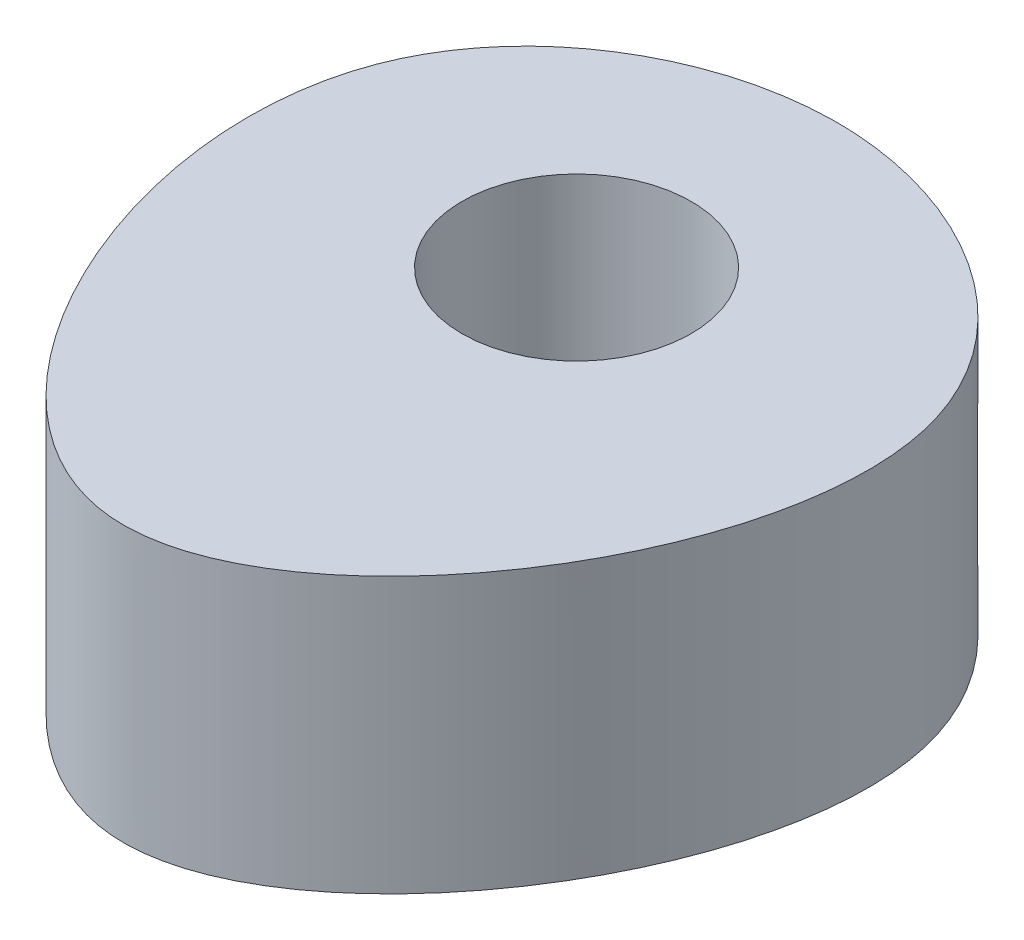
ISO-10303-21;
HEADER;
FILE_DESCRIPTION(('STEP AP214'),'2;1');
FILE_NAME('part.step','',(''),(''),'','','');
FILE_SCHEMA(('AUTOMOTIVE_DESIGN { 1 0 10303 214 1 1 1 1 }'));
ENDSEC;
DATA;
#1=APPLICATION_CONTEXT('core data for automotive mechanical design processes');
#2=APPLICATION_PROTOCOL_DEFINITION('international standard','automotive_design',2000,#1);
#3=PRODUCT_CONTEXT('',#1,'mechanical');
#4=PRODUCT('Part','Part','',(#3));
#5=PRODUCT_RELATED_PRODUCT_CATEGORY('part','',(#4));
#6=PRODUCT_DEFINITION_FORMATION('','',#4);
#7=PRODUCT_DEFINITION_CONTEXT('part definition',#1,'design');
#8=PRODUCT_DEFINITION('design','',#6,#7);
#9=PRODUCT_DEFINITION_SHAPE('','',#8);
#10=(LENGTH_UNIT() NAMED_UNIT(*) SI_UNIT(.MILLI.,.METRE.));
#11=(NAMED_UNIT(*) PLANE_ANGLE_UNIT() SI_UNIT($,.RADIAN.));
#12=(NAMED_UNIT(*) SI_UNIT($,.STERADIAN.) SOLID_ANGLE_UNIT());
#13=UNCERTAINTY_MEASURE_WITH_UNIT(LENGTH_MEASURE(1.E-05),#10,'distance_accuracy_value','');
#14=(GEOMETRIC_REPRESENTATION_CONTEXT(3) GLOBAL_UNCERTAINTY_ASSIGNED_CONTEXT((#13)) GLOBAL_UNIT_ASSIGNED_CONTEXT((#10,
#11,#12)) REPRESENTATION_CONTEXT('',''));
#15=CARTESIAN_POINT('',(0.,0.,0.));
#16=DIRECTION('',(0.,0.,1.));
#17=DIRECTION('',(1.,0.,0.));
#18=AXIS2_PLACEMENT_3D('',#15,#16,#17);
#19=CARTESIAN_POINT('',(1.15195998475415,30.,48.9622364822149));
#20=DIRECTION('',(0.,-1.,0.));
#21=DIRECTION('',(0.,0.,-1.));
#22=AXIS2_PLACEMENT_3D('',#19,#20,#21);
#23=PLANE('',#22);
#24=CARTESIAN_POINT('',(0.,30.,-27.9028182668132));
#25=CARTESIAN_POINT('',(-12.8653560561896,30.,-27.7229644163359));
#26=CARTESIAN_POINT('',(-47.9510198881678,30.,-7.00606831597385));
#27=CARTESIAN_POINT('',(-3.58547018882932,30.,83.1883366938912));
#28=CARTESIAN_POINT('',(54.0443844706418,30.,-4.07073540328584));
#29=CARTESIAN_POINT('',(14.8248103614878,30.,-28.1100647055797));
#30=CARTESIAN_POINT('',(0.,30.,-27.9028182668132));
#31=B_SPLINE_CURVE_WITH_KNOTS('',3,(#24,#25,#26,#27,#28,#29,#30),.UNSPECIFIED.,.T.,.F.,(4,1,1,1,
4),(0.,0.173631519767977,0.486630839659151,0.799923582208299,1.),.UNSPECIFIED.);
#32=CARTESIAN_POINT('',(0.,30.,-27.9028182668132));
#33=VERTEX_POINT('',#32);
#34=EDGE_CURVE('E10',#33,#33,#31,.T.);
#35=ORIENTED_EDGE('',*,*,#34,.T.);
#36=EDGE_LOOP('',(#35));
#37=FACE_BOUND('',#36,.T.);
#38=CARTESIAN_POINT('',(0.,30.,0.));
#39=DIRECTION('',(0.,1.,0.));
#40=DIRECTION('',(0.,0.,1.));
#41=AXIS2_PLACEMENT_3D('',#38,#39,#40);
#42=CIRCLE('',#41,12.5);
#43=CARTESIAN_POINT('',(0.,30.,12.5));
#44=VERTEX_POINT('',#43);
#45=EDGE_CURVE('E47',#44,#44,#42,.T.);
#46=ORIENTED_EDGE('',*,*,#45,.F.);
#47=EDGE_LOOP('',(#46));
#48=FACE_BOUND('',#47,.T.);
#49=ADVANCED_FACE('F34',(#37,#48),#23,.F.);
#50=CARTESIAN_POINT('',(1.15195998475415,0.,48.9622364822149));
#51=DIRECTION('',(0.,-1.,0.));
#52=DIRECTION('',(0.,0.,-1.));
#53=AXIS2_PLACEMENT_3D('',#50,#51,#52);
#54=PLANE('',#53);
#55=CARTESIAN_POINT('',(0.,0.,-27.9028182668132));
#56=CARTESIAN_POINT('',(-12.8653560561896,0.,-27.7229644163359));
#57=CARTESIAN_POINT('',(-47.9510198881678,0.,-7.00606831597385));
#58=CARTESIAN_POINT('',(-3.58547018882932,0.,83.1883366938912));
#59=CARTESIAN_POINT('',(54.0443844706418,0.,-4.07073540328584));
#60=CARTESIAN_POINT('',(14.8248103614878,0.,-28.1100647055797));
#61=CARTESIAN_POINT('',(0.,0.,-27.9028182668132));
#62=B_SPLINE_CURVE_WITH_KNOTS('',3,(#55,#56,#57,#58,#59,#60,#61),.UNSPECIFIED.,.T.,.F.,(4,1,1,1,
4),(0.,0.173631519767977,0.486630839659151,0.799923582208299,1.),.UNSPECIFIED.);
#63=CARTESIAN_POINT('',(0.,0.,-27.9028182668132));
#64=VERTEX_POINT('',#63);
#65=EDGE_CURVE('E39',#64,#64,#62,.T.);
#66=ORIENTED_EDGE('',*,*,#65,.F.);
#67=EDGE_LOOP('',(#66));
#68=FACE_BOUND('',#67,.T.);
#69=CARTESIAN_POINT('',(0.,0.,0.));
#70=DIRECTION('',(0.,1.,0.));
#71=DIRECTION('',(0.,0.,1.));
#72=AXIS2_PLACEMENT_3D('',#69,#70,#71);
#73=CIRCLE('',#72,12.5);
#74=CARTESIAN_POINT('',(0.,0.,12.5));
#75=VERTEX_POINT('',#74);
#76=EDGE_CURVE('E52',#75,#75,#73,.T.);
#77=ORIENTED_EDGE('',*,*,#76,.T.);
#78=EDGE_LOOP('',(#77));
#79=FACE_BOUND('',#78,.T.);
#80=ADVANCED_FACE('F65',(#68,#79),#54,.T.);
#81=DIRECTION('',(0.,-1.,0.));
#82=VECTOR('',#81,1.);
#83=SURFACE_OF_LINEAR_EXTRUSION('',#31,#82);
#84=ORIENTED_EDGE('',*,*,#34,.F.);
#85=EDGE_LOOP('',(#84));
#86=FACE_BOUND('',#85,.T.);
#87=ORIENTED_EDGE('',*,*,#65,.T.);
#88=EDGE_LOOP('',(#87));
#89=FACE_BOUND('',#88,.T.);
#90=ADVANCED_FACE('F36',(#86,#89),#83,.F.);
#91=CARTESIAN_POINT('',(0.,30.,0.));
#92=DIRECTION('',(0.,-1.,0.));
#93=DIRECTION('',(0.,0.,-1.));
#94=AXIS2_PLACEMENT_3D('',#91,#92,#93);
#95=CYLINDRICAL_SURFACE('',#94,12.5);
#96=ORIENTED_EDGE('',*,*,#45,.T.);
#97=EDGE_LOOP('',(#96));
#98=FACE_BOUND('',#97,.T.);
#99=ORIENTED_EDGE('',*,*,#76,.F.);
#100=EDGE_LOOP('',(#99));
#101=FACE_BOUND('',#100,.T.);
#102=ADVANCED_FACE('F61',(#98,#101),#95,.F.);
#103=CLOSED_SHELL('',(#49,#80,#90,#102));
#104=MANIFOLD_SOLID_BREP('B2',#103);
#105=ADVANCED_BREP_SHAPE_REPRESENTATION('',(#18,#104),#14);
#106=SHAPE_DEFINITION_REPRESENTATION(#9,#105);
ENDSEC;
END-ISO-10303-21;
